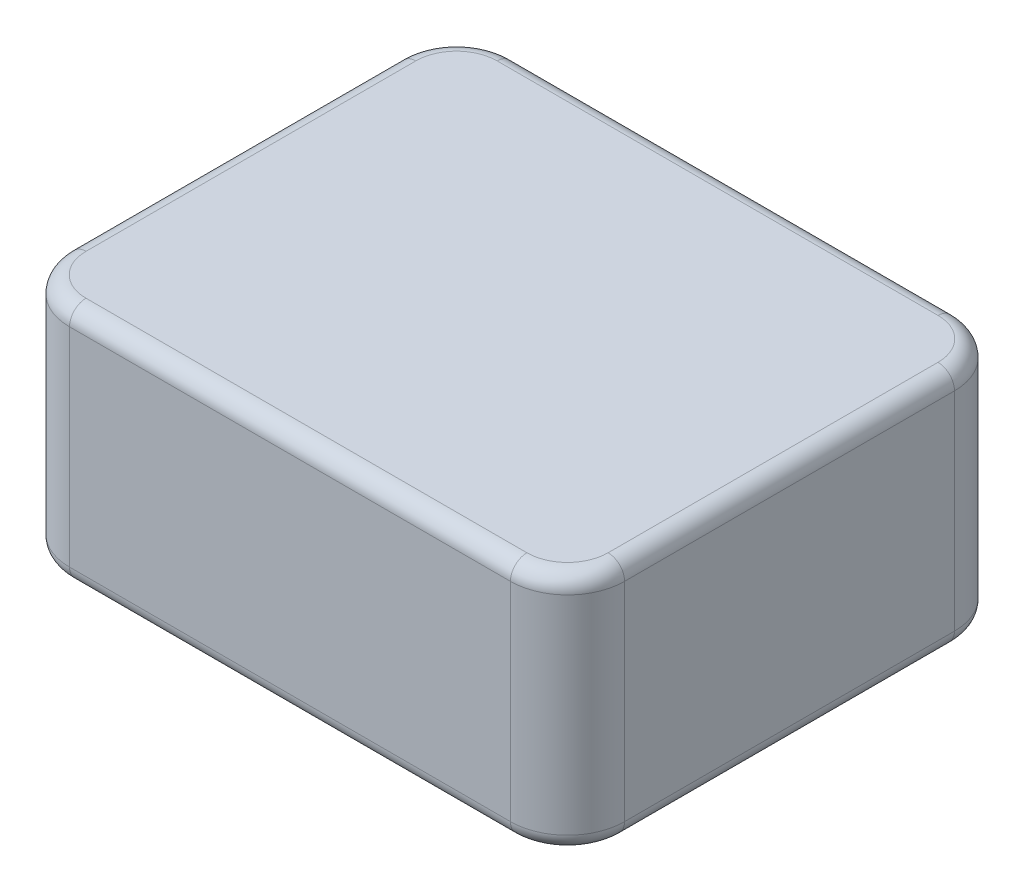
ISO-10303-21;
HEADER;
FILE_DESCRIPTION(('STEP AP214'),'2;1');
FILE_NAME('part.step','',(''),(''),'','','');
FILE_SCHEMA(('AUTOMOTIVE_DESIGN { 1 0 10303 214 1 1 1 1 }'));
ENDSEC;
DATA;
#1=APPLICATION_CONTEXT('core data for automotive mechanical design processes');
#2=APPLICATION_PROTOCOL_DEFINITION('international standard','automotive_design',2000,#1);
#3=PRODUCT_CONTEXT('',#1,'mechanical');
#4=PRODUCT('Part','Part','',(#3));
#5=PRODUCT_RELATED_PRODUCT_CATEGORY('part','',(#4));
#6=PRODUCT_DEFINITION_FORMATION('','',#4);
#7=PRODUCT_DEFINITION_CONTEXT('part definition',#1,'design');
#8=PRODUCT_DEFINITION('design','',#6,#7);
#9=PRODUCT_DEFINITION_SHAPE('','',#8);
#10=(LENGTH_UNIT() NAMED_UNIT(*) SI_UNIT(.MILLI.,.METRE.));
#11=(NAMED_UNIT(*) PLANE_ANGLE_UNIT() SI_UNIT($,.RADIAN.));
#12=(NAMED_UNIT(*) SI_UNIT($,.STERADIAN.) SOLID_ANGLE_UNIT());
#13=UNCERTAINTY_MEASURE_WITH_UNIT(LENGTH_MEASURE(1.E-05),#10,'distance_accuracy_value','');
#14=(GEOMETRIC_REPRESENTATION_CONTEXT(3) GLOBAL_UNCERTAINTY_ASSIGNED_CONTEXT((#13)) GLOBAL_UNIT_ASSIGNED_CONTEXT((#10,
#11,#12)) REPRESENTATION_CONTEXT('',''));
#15=CARTESIAN_POINT('',(0.,0.,0.));
#16=DIRECTION('',(0.,0.,1.));
#17=DIRECTION('',(1.,0.,0.));
#18=AXIS2_PLACEMENT_3D('',#15,#16,#17);
#19=CARTESIAN_POINT('',(11.43,48.26,-77.47));
#20=DIRECTION('',(0.,-1.,0.));
#21=DIRECTION('',(0.,0.,-1.));
#22=AXIS2_PLACEMENT_3D('',#19,#20,#21);
#23=CYLINDRICAL_SURFACE('',#22,11.43);
#24=DIRECTION('',(0.,-1.,0.));
#25=VECTOR('',#24,1.);
#26=CARTESIAN_POINT('',(11.4300000000001,48.26,-88.9));
#27=LINE('',#26,#25);
#28=CARTESIAN_POINT('',(11.4300000000001,44.958,-88.9));
#29=VERTEX_POINT('',#28);
#30=CARTESIAN_POINT('',(11.4300000000001,3.30200000000001,-88.9));
#31=VERTEX_POINT('',#30);
#32=EDGE_CURVE('E267',#29,#31,#27,.T.);
#33=ORIENTED_EDGE('',*,*,#32,.T.);
#34=CARTESIAN_POINT('',(11.43,3.30199999999999,-77.47));
#35=DIRECTION('',(0.,-1.,0.));
#36=DIRECTION('',(0.,0.,-1.));
#37=AXIS2_PLACEMENT_3D('',#34,#35,#36);
#38=CIRCLE('',#37,11.43);
#39=CARTESIAN_POINT('',(0.,3.30200000000001,-77.4699999999999));
#40=VERTEX_POINT('',#39);
#41=EDGE_CURVE('E232',#31,#40,#38,.F.);
#42=ORIENTED_EDGE('',*,*,#41,.T.);
#43=DIRECTION('',(0.,-1.,0.));
#44=VECTOR('',#43,1.);
#45=CARTESIAN_POINT('',(0.,48.26,-77.4699999999999));
#46=LINE('',#45,#44);
#47=CARTESIAN_POINT('',(0.,44.958,-77.4699999999999));
#48=VERTEX_POINT('',#47);
#49=EDGE_CURVE('E171',#48,#40,#46,.T.);
#50=ORIENTED_EDGE('',*,*,#49,.F.);
#51=CARTESIAN_POINT('',(11.43,44.958,-77.47));
#52=DIRECTION('',(0.,-1.,0.));
#53=DIRECTION('',(0.,0.,-1.));
#54=AXIS2_PLACEMENT_3D('',#51,#52,#53);
#55=CIRCLE('',#54,11.43);
#56=EDGE_CURVE('E230',#48,#29,#55,.T.);
#57=ORIENTED_EDGE('',*,*,#56,.T.);
#58=EDGE_LOOP('',(#33,#42,#50,#57));
#59=FACE_BOUND('',#58,.T.);
#60=ADVANCED_FACE('F35',(#59),#23,.T.);
#61=CARTESIAN_POINT('',(0.,48.26,-11.4300000000001));
#62=DIRECTION('',(1.,0.,0.));
#63=DIRECTION('',(0.,0.,-1.));
#64=AXIS2_PLACEMENT_3D('',#61,#62,#63);
#65=PLANE('',#64);
#66=ORIENTED_EDGE('',*,*,#49,.T.);
#67=DIRECTION('',(0.,0.,1.));
#68=VECTOR('',#67,1.);
#69=CARTESIAN_POINT('',(0.,3.302,-11.4300000000001));
#70=LINE('',#69,#68);
#71=CARTESIAN_POINT('',(0.,3.30200000000001,-11.4300000000001));
#72=VERTEX_POINT('',#71);
#73=EDGE_CURVE('E170',#40,#72,#70,.T.);
#74=ORIENTED_EDGE('',*,*,#73,.T.);
#75=DIRECTION('',(0.,-1.,0.));
#76=VECTOR('',#75,1.);
#77=CARTESIAN_POINT('',(0.,48.26,-11.4300000000001));
#78=LINE('',#77,#76);
#79=CARTESIAN_POINT('',(0.,44.958,-11.4300000000001));
#80=VERTEX_POINT('',#79);
#81=EDGE_CURVE('E152',#80,#72,#78,.T.);
#82=ORIENTED_EDGE('',*,*,#81,.F.);
#83=DIRECTION('',(0.,0.,1.));
#84=VECTOR('',#83,1.);
#85=CARTESIAN_POINT('',(0.,44.958,-11.4300000000001));
#86=LINE('',#85,#84);
#87=EDGE_CURVE('E167',#80,#48,#86,.F.);
#88=ORIENTED_EDGE('',*,*,#87,.T.);
#89=EDGE_LOOP('',(#66,#74,#82,#88));
#90=FACE_BOUND('',#89,.T.);
#91=ADVANCED_FACE('F165',(#90),#65,.F.);
#92=CARTESIAN_POINT('',(11.43,48.26,-11.43));
#93=DIRECTION('',(0.,-1.,0.));
#94=DIRECTION('',(0.,0.,-1.));
#95=AXIS2_PLACEMENT_3D('',#92,#93,#94);
#96=CYLINDRICAL_SURFACE('',#95,11.43);
#97=ORIENTED_EDGE('',*,*,#81,.T.);
#98=CARTESIAN_POINT('',(11.43,3.30199999999999,-11.43));
#99=DIRECTION('',(0.,-1.,0.));
#100=DIRECTION('',(0.,0.,-1.));
#101=AXIS2_PLACEMENT_3D('',#98,#99,#100);
#102=CIRCLE('',#101,11.43);
#103=CARTESIAN_POINT('',(11.4300000000001,3.30200000000001,0.));
#104=VERTEX_POINT('',#103);
#105=EDGE_CURVE('E159',#72,#104,#102,.F.);
#106=ORIENTED_EDGE('',*,*,#105,.T.);
#107=DIRECTION('',(0.,-1.,0.));
#108=VECTOR('',#107,1.);
#109=CARTESIAN_POINT('',(11.4300000000001,48.26,0.));
#110=LINE('',#109,#108);
#111=CARTESIAN_POINT('',(11.4300000000001,44.958,0.));
#112=VERTEX_POINT('',#111);
#113=EDGE_CURVE('E154',#112,#104,#110,.T.);
#114=ORIENTED_EDGE('',*,*,#113,.F.);
#115=CARTESIAN_POINT('',(11.43,44.958,-11.43));
#116=DIRECTION('',(0.,-1.,0.));
#117=DIRECTION('',(0.,0.,-1.));
#118=AXIS2_PLACEMENT_3D('',#115,#116,#117);
#119=CIRCLE('',#118,11.43);
#120=EDGE_CURVE('E149',#112,#80,#119,.T.);
#121=ORIENTED_EDGE('',*,*,#120,.T.);
#122=EDGE_LOOP('',(#97,#106,#114,#121));
#123=FACE_BOUND('',#122,.T.);
#124=ADVANCED_FACE('F151',(#123),#96,.T.);
#125=CARTESIAN_POINT('',(11.4300000000001,48.26,0.));
#126=DIRECTION('',(0.,0.,-1.));
#127=DIRECTION('',(-1.,0.,0.));
#128=AXIS2_PLACEMENT_3D('',#125,#126,#127);
#129=PLANE('',#128);
#130=ORIENTED_EDGE('',*,*,#113,.T.);
#131=DIRECTION('',(1.,0.,0.));
#132=VECTOR('',#131,1.);
#133=CARTESIAN_POINT('',(99.6949999999999,3.302,0.));
#134=LINE('',#133,#132);
#135=CARTESIAN_POINT('',(99.6949999999999,3.30200000000001,0.));
#136=VERTEX_POINT('',#135);
#137=EDGE_CURVE('E211',#104,#136,#134,.T.);
#138=ORIENTED_EDGE('',*,*,#137,.T.);
#139=DIRECTION('',(0.,-1.,0.));
#140=VECTOR('',#139,1.);
#141=CARTESIAN_POINT('',(99.6949999999999,48.26,0.));
#142=LINE('',#141,#140);
#143=CARTESIAN_POINT('',(99.6949999999999,44.958,0.));
#144=VERTEX_POINT('',#143);
#145=EDGE_CURVE('E292',#144,#136,#142,.T.);
#146=ORIENTED_EDGE('',*,*,#145,.F.);
#147=DIRECTION('',(1.,0.,0.));
#148=VECTOR('',#147,1.);
#149=CARTESIAN_POINT('',(11.4300000000001,44.958,0.));
#150=LINE('',#149,#148);
#151=EDGE_CURVE('E209',#144,#112,#150,.F.);
#152=ORIENTED_EDGE('',*,*,#151,.T.);
#153=EDGE_LOOP('',(#130,#138,#146,#152));
#154=FACE_BOUND('',#153,.T.);
#155=ADVANCED_FACE('F289',(#154),#129,.F.);
#156=CARTESIAN_POINT('',(99.695,48.26,-11.43));
#157=DIRECTION('',(0.,-1.,0.));
#158=DIRECTION('',(0.,0.,-1.));
#159=AXIS2_PLACEMENT_3D('',#156,#157,#158);
#160=CYLINDRICAL_SURFACE('',#159,11.43);
#161=ORIENTED_EDGE('',*,*,#145,.T.);
#162=CARTESIAN_POINT('',(99.695,3.30199999999999,-11.43));
#163=DIRECTION('',(0.,-1.,0.));
#164=DIRECTION('',(0.,0.,-1.));
#165=AXIS2_PLACEMENT_3D('',#162,#163,#164);
#166=CIRCLE('',#165,11.43);
#167=CARTESIAN_POINT('',(111.125,3.30200000000001,-11.4300000000001));
#168=VERTEX_POINT('',#167);
#169=EDGE_CURVE('E215',#136,#168,#166,.F.);
#170=ORIENTED_EDGE('',*,*,#169,.T.);
#171=DIRECTION('',(0.,-1.,0.));
#172=VECTOR('',#171,1.);
#173=CARTESIAN_POINT('',(111.125,48.26,-11.4300000000001));
#174=LINE('',#173,#172);
#175=CARTESIAN_POINT('',(111.125,44.958,-11.4300000000001));
#176=VERTEX_POINT('',#175);
#177=EDGE_CURVE('E295',#176,#168,#174,.T.);
#178=ORIENTED_EDGE('',*,*,#177,.F.);
#179=CARTESIAN_POINT('',(99.695,44.958,-11.43));
#180=DIRECTION('',(0.,-1.,0.));
#181=DIRECTION('',(0.,0.,-1.));
#182=AXIS2_PLACEMENT_3D('',#179,#180,#181);
#183=CIRCLE('',#182,11.43);
#184=EDGE_CURVE('E213',#176,#144,#183,.T.);
#185=ORIENTED_EDGE('',*,*,#184,.T.);
#186=EDGE_LOOP('',(#161,#170,#178,#185));
#187=FACE_BOUND('',#186,.T.);
#188=ADVANCED_FACE('F340',(#187),#160,.T.);
#189=CARTESIAN_POINT('',(111.125,48.26,-11.4300000000001));
#190=DIRECTION('',(-1.,0.,0.));
#191=DIRECTION('',(0.,0.,1.));
#192=AXIS2_PLACEMENT_3D('',#189,#190,#191);
#193=PLANE('',#192);
#194=ORIENTED_EDGE('',*,*,#177,.T.);
#195=DIRECTION('',(0.,0.,-1.));
#196=VECTOR('',#195,1.);
#197=CARTESIAN_POINT('',(111.125,3.302,-77.4699999999999));
#198=LINE('',#197,#196);
#199=CARTESIAN_POINT('',(111.125,3.30200000000001,-77.4699999999999));
#200=VERTEX_POINT('',#199);
#201=EDGE_CURVE('E219',#168,#200,#198,.T.);
#202=ORIENTED_EDGE('',*,*,#201,.T.);
#203=DIRECTION('',(0.,-1.,0.));
#204=VECTOR('',#203,1.);
#205=CARTESIAN_POINT('',(111.125,48.26,-77.4699999999999));
#206=LINE('',#205,#204);
#207=CARTESIAN_POINT('',(111.125,44.958,-77.4699999999999));
#208=VERTEX_POINT('',#207);
#209=EDGE_CURVE('E299',#208,#200,#206,.T.);
#210=ORIENTED_EDGE('',*,*,#209,.F.);
#211=DIRECTION('',(0.,0.,-1.));
#212=VECTOR('',#211,1.);
#213=CARTESIAN_POINT('',(111.125,44.958,-11.4300000000001));
#214=LINE('',#213,#212);
#215=EDGE_CURVE('E217',#208,#176,#214,.F.);
#216=ORIENTED_EDGE('',*,*,#215,.T.);
#217=EDGE_LOOP('',(#194,#202,#210,#216));
#218=FACE_BOUND('',#217,.T.);
#219=ADVANCED_FACE('F343',(#218),#193,.F.);
#220=CARTESIAN_POINT('',(99.695,48.26,-77.47));
#221=DIRECTION('',(0.,-1.,0.));
#222=DIRECTION('',(0.,0.,-1.));
#223=AXIS2_PLACEMENT_3D('',#220,#221,#222);
#224=CYLINDRICAL_SURFACE('',#223,11.43);
#225=ORIENTED_EDGE('',*,*,#209,.T.);
#226=CARTESIAN_POINT('',(99.695,3.30199999999999,-77.47));
#227=DIRECTION('',(0.,-1.,0.));
#228=DIRECTION('',(0.,0.,-1.));
#229=AXIS2_PLACEMENT_3D('',#226,#227,#228);
#230=CIRCLE('',#229,11.43);
#231=CARTESIAN_POINT('',(99.6949999999999,3.30200000000001,-88.9));
#232=VERTEX_POINT('',#231);
#233=EDGE_CURVE('E223',#200,#232,#230,.F.);
#234=ORIENTED_EDGE('',*,*,#233,.T.);
#235=DIRECTION('',(0.,-1.,0.));
#236=VECTOR('',#235,1.);
#237=CARTESIAN_POINT('',(99.6949999999999,48.26,-88.9));
#238=LINE('',#237,#236);
#239=CARTESIAN_POINT('',(99.6949999999999,44.958,-88.9));
#240=VERTEX_POINT('',#239);
#241=EDGE_CURVE('E304',#240,#232,#238,.T.);
#242=ORIENTED_EDGE('',*,*,#241,.F.);
#243=CARTESIAN_POINT('',(99.695,44.958,-77.47));
#244=DIRECTION('',(0.,-1.,0.));
#245=DIRECTION('',(0.,0.,-1.));
#246=AXIS2_PLACEMENT_3D('',#243,#244,#245);
#247=CIRCLE('',#246,11.43);
#248=EDGE_CURVE('E221',#240,#208,#247,.T.);
#249=ORIENTED_EDGE('',*,*,#248,.T.);
#250=EDGE_LOOP('',(#225,#234,#242,#249));
#251=FACE_BOUND('',#250,.T.);
#252=ADVANCED_FACE('F357',(#251),#224,.T.);
#253=CARTESIAN_POINT('',(11.4300000000001,48.26,-88.9));
#254=DIRECTION('',(0.,0.,1.));
#255=DIRECTION('',(1.,0.,0.));
#256=AXIS2_PLACEMENT_3D('',#253,#254,#255);
#257=PLANE('',#256);
#258=ORIENTED_EDGE('',*,*,#241,.T.);
#259=DIRECTION('',(-1.,0.,0.));
#260=VECTOR('',#259,1.);
#261=CARTESIAN_POINT('',(11.4300000000001,3.302,-88.9));
#262=LINE('',#261,#260);
#263=EDGE_CURVE('E228',#232,#31,#262,.T.);
#264=ORIENTED_EDGE('',*,*,#263,.T.);
#265=ORIENTED_EDGE('',*,*,#32,.F.);
#266=DIRECTION('',(-1.,0.,0.));
#267=VECTOR('',#266,1.);
#268=CARTESIAN_POINT('',(11.4300000000001,44.958,-88.9));
#269=LINE('',#268,#267);
#270=EDGE_CURVE('E225',#29,#240,#269,.F.);
#271=ORIENTED_EDGE('',*,*,#270,.T.);
#272=EDGE_LOOP('',(#258,#264,#265,#271));
#273=FACE_BOUND('',#272,.T.);
#274=ADVANCED_FACE('F358',(#273),#257,.F.);
#275=CARTESIAN_POINT('',(11.43,48.26,-77.47));
#276=DIRECTION('',(0.,-1.,0.));
#277=DIRECTION('',(0.,0.,-1.));
#278=AXIS2_PLACEMENT_3D('',#275,#276,#277);
#279=PLANE('',#278);
#280=CARTESIAN_POINT('',(99.695,48.26,-77.47));
#281=DIRECTION('',(0.,-1.,0.));
#282=DIRECTION('',(0.,0.,-1.));
#283=AXIS2_PLACEMENT_3D('',#280,#281,#282);
#284=CIRCLE('',#283,8.128);
#285=CARTESIAN_POINT('',(107.823,48.26,-77.4699999999999));
#286=VERTEX_POINT('',#285);
#287=CARTESIAN_POINT('',(99.6949999999999,48.26,-85.598));
#288=VERTEX_POINT('',#287);
#289=EDGE_CURVE('E44',#286,#288,#284,.F.);
#290=ORIENTED_EDGE('',*,*,#289,.T.);
#291=DIRECTION('',(-1.,0.,0.));
#292=VECTOR('',#291,1.);
#293=CARTESIAN_POINT('',(11.43,48.26,-85.598));
#294=LINE('',#293,#292);
#295=CARTESIAN_POINT('',(11.4300000000001,48.26,-85.598));
#296=VERTEX_POINT('',#295);
#297=EDGE_CURVE('E11',#288,#296,#294,.T.);
#298=ORIENTED_EDGE('',*,*,#297,.T.);
#299=CARTESIAN_POINT('',(11.43,48.26,-77.47));
#300=DIRECTION('',(0.,-1.,0.));
#301=DIRECTION('',(0.,0.,-1.));
#302=AXIS2_PLACEMENT_3D('',#299,#300,#301);
#303=CIRCLE('',#302,8.128);
#304=CARTESIAN_POINT('',(3.302,48.26,-77.4699999999999));
#305=VERTEX_POINT('',#304);
#306=EDGE_CURVE('E234',#296,#305,#303,.F.);
#307=ORIENTED_EDGE('',*,*,#306,.T.);
#308=DIRECTION('',(0.,0.,1.));
#309=VECTOR('',#308,1.);
#310=CARTESIAN_POINT('',(3.302,48.26,-77.47));
#311=LINE('',#310,#309);
#312=CARTESIAN_POINT('',(3.302,48.26,-11.4300000000001));
#313=VERTEX_POINT('',#312);
#314=EDGE_CURVE('E236',#305,#313,#311,.T.);
#315=ORIENTED_EDGE('',*,*,#314,.T.);
#316=CARTESIAN_POINT('',(11.43,48.26,-11.43));
#317=DIRECTION('',(0.,-1.,0.));
#318=DIRECTION('',(0.,0.,-1.));
#319=AXIS2_PLACEMENT_3D('',#316,#317,#318);
#320=CIRCLE('',#319,8.128);
#321=CARTESIAN_POINT('',(11.4300000000001,48.26,-3.302));
#322=VERTEX_POINT('',#321);
#323=EDGE_CURVE('E177',#313,#322,#320,.F.);
#324=ORIENTED_EDGE('',*,*,#323,.T.);
#325=DIRECTION('',(1.,0.,0.));
#326=VECTOR('',#325,1.);
#327=CARTESIAN_POINT('',(11.43,48.26,-3.302));
#328=LINE('',#327,#326);
#329=CARTESIAN_POINT('',(99.695,48.26,-3.302));
#330=VERTEX_POINT('',#329);
#331=EDGE_CURVE('E239',#322,#330,#328,.T.);
#332=ORIENTED_EDGE('',*,*,#331,.T.);
#333=CARTESIAN_POINT('',(99.695,48.26,-11.43));
#334=DIRECTION('',(0.,-1.,0.));
#335=DIRECTION('',(0.,0.,-1.));
#336=AXIS2_PLACEMENT_3D('',#333,#334,#335);
#337=CIRCLE('',#336,8.128);
#338=CARTESIAN_POINT('',(107.823,48.26,-11.4300000000001));
#339=VERTEX_POINT('',#338);
#340=EDGE_CURVE('E241',#330,#339,#337,.F.);
#341=ORIENTED_EDGE('',*,*,#340,.T.);
#342=DIRECTION('',(0.,0.,-1.));
#343=VECTOR('',#342,1.);
#344=CARTESIAN_POINT('',(107.823,48.26,-77.47));
#345=LINE('',#344,#343);
#346=EDGE_CURVE('E55',#339,#286,#345,.T.);
#347=ORIENTED_EDGE('',*,*,#346,.T.);
#348=EDGE_LOOP('',(#290,#298,#307,#315,#324,#332,#341,#347));
#349=FACE_BOUND('',#348,.T.);
#350=ADVANCED_FACE('F367',(#349),#279,.F.);
#351=CARTESIAN_POINT('',(11.43,0.,-77.47));
#352=DIRECTION('',(0.,-1.,0.));
#353=DIRECTION('',(0.,0.,-1.));
#354=AXIS2_PLACEMENT_3D('',#351,#352,#353);
#355=PLANE('',#354);
#356=CARTESIAN_POINT('',(11.43,0.,-11.43));
#357=DIRECTION('',(0.,-1.,0.));
#358=DIRECTION('',(0.,0.,-1.));
#359=AXIS2_PLACEMENT_3D('',#356,#357,#358);
#360=CIRCLE('',#359,8.128);
#361=CARTESIAN_POINT('',(11.4300000000001,0.,-3.302));
#362=VERTEX_POINT('',#361);
#363=CARTESIAN_POINT('',(3.302,0.,-11.4300000000001));
#364=VERTEX_POINT('',#363);
#365=EDGE_CURVE('E204',#362,#364,#360,.T.);
#366=ORIENTED_EDGE('',*,*,#365,.T.);
#367=DIRECTION('',(0.,0.,1.));
#368=VECTOR('',#367,1.);
#369=CARTESIAN_POINT('',(3.302,0.,-77.4699999999999));
#370=LINE('',#369,#368);
#371=CARTESIAN_POINT('',(3.302,0.,-77.4699999999999));
#372=VERTEX_POINT('',#371);
#373=EDGE_CURVE('E160',#364,#372,#370,.F.);
#374=ORIENTED_EDGE('',*,*,#373,.T.);
#375=CARTESIAN_POINT('',(11.43,0.,-77.47));
#376=DIRECTION('',(0.,-1.,0.));
#377=DIRECTION('',(0.,0.,-1.));
#378=AXIS2_PLACEMENT_3D('',#375,#376,#377);
#379=CIRCLE('',#378,8.128);
#380=CARTESIAN_POINT('',(11.4300000000001,0.,-85.598));
#381=VERTEX_POINT('',#380);
#382=EDGE_CURVE('E189',#372,#381,#379,.T.);
#383=ORIENTED_EDGE('',*,*,#382,.T.);
#384=DIRECTION('',(-1.,0.,0.));
#385=VECTOR('',#384,1.);
#386=CARTESIAN_POINT('',(99.6949999999999,0.,-85.598));
#387=LINE('',#386,#385);
#388=CARTESIAN_POINT('',(99.695,0.,-85.598));
#389=VERTEX_POINT('',#388);
#390=EDGE_CURVE('E194',#381,#389,#387,.F.);
#391=ORIENTED_EDGE('',*,*,#390,.T.);
#392=CARTESIAN_POINT('',(99.695,0.,-77.47));
#393=DIRECTION('',(0.,-1.,0.));
#394=DIRECTION('',(0.,0.,-1.));
#395=AXIS2_PLACEMENT_3D('',#392,#393,#394);
#396=CIRCLE('',#395,8.128);
#397=CARTESIAN_POINT('',(107.823,0.,-77.4699999999999));
#398=VERTEX_POINT('',#397);
#399=EDGE_CURVE('E196',#389,#398,#396,.T.);
#400=ORIENTED_EDGE('',*,*,#399,.T.);
#401=DIRECTION('',(0.,0.,-1.));
#402=VECTOR('',#401,1.);
#403=CARTESIAN_POINT('',(107.823,0.,-11.4300000000001));
#404=LINE('',#403,#402);
#405=CARTESIAN_POINT('',(107.823,0.,-11.4300000000001));
#406=VERTEX_POINT('',#405);
#407=EDGE_CURVE('E198',#398,#406,#404,.F.);
#408=ORIENTED_EDGE('',*,*,#407,.T.);
#409=CARTESIAN_POINT('',(99.695,0.,-11.43));
#410=DIRECTION('',(0.,-1.,0.));
#411=DIRECTION('',(0.,0.,-1.));
#412=AXIS2_PLACEMENT_3D('',#409,#410,#411);
#413=CIRCLE('',#412,8.128);
#414=CARTESIAN_POINT('',(99.6949999999999,0.,-3.302));
#415=VERTEX_POINT('',#414);
#416=EDGE_CURVE('E200',#406,#415,#413,.T.);
#417=ORIENTED_EDGE('',*,*,#416,.T.);
#418=DIRECTION('',(1.,0.,0.));
#419=VECTOR('',#418,1.);
#420=CARTESIAN_POINT('',(11.4300000000001,0.,-3.302));
#421=LINE('',#420,#419);
#422=EDGE_CURVE('E202',#415,#362,#421,.F.);
#423=ORIENTED_EDGE('',*,*,#422,.T.);
#424=EDGE_LOOP('',(#366,#374,#383,#391,#400,#408,#417,#423));
#425=FACE_BOUND('',#424,.T.);
#426=ADVANCED_FACE('F369',(#425),#355,.T.);
#427=CARTESIAN_POINT('',(107.823,3.302,-11.4300000000001));
#428=DIRECTION('',(0.,0.,1.));
#429=DIRECTION('',(1.,0.,0.));
#430=AXIS2_PLACEMENT_3D('',#427,#428,#429);
#431=CYLINDRICAL_SURFACE('',#430,3.302);
#432=CARTESIAN_POINT('',(107.823,3.302,-11.4300000000001));
#433=DIRECTION('',(0.,0.,1.));
#434=DIRECTION('',(1.,0.,0.));
#435=AXIS2_PLACEMENT_3D('',#432,#433,#434);
#436=CIRCLE('',#435,3.302);
#437=EDGE_CURVE('E261',#406,#168,#436,.T.);
#438=ORIENTED_EDGE('',*,*,#437,.F.);
#439=ORIENTED_EDGE('',*,*,#407,.F.);
#440=CARTESIAN_POINT('',(107.823,3.302,-77.4699999999999));
#441=DIRECTION('',(0.,0.,-1.));
#442=DIRECTION('',(-1.,0.,0.));
#443=AXIS2_PLACEMENT_3D('',#440,#441,#442);
#444=CIRCLE('',#443,3.302);
#445=EDGE_CURVE('E264',#200,#398,#444,.T.);
#446=ORIENTED_EDGE('',*,*,#445,.F.);
#447=ORIENTED_EDGE('',*,*,#201,.F.);
#448=EDGE_LOOP('',(#438,#439,#446,#447));
#449=FACE_BOUND('',#448,.T.);
#450=ADVANCED_FACE('F348',(#449),#431,.T.);
#451=CARTESIAN_POINT('',(99.695,3.302,-77.47));
#452=DIRECTION('',(0.,-1.,0.));
#453=DIRECTION('',(0.,0.,-1.));
#454=AXIS2_PLACEMENT_3D('',#451,#452,#453);
#455=TOROIDAL_SURFACE('',#454,8.128,3.302);
#456=ORIENTED_EDGE('',*,*,#445,.T.);
#457=ORIENTED_EDGE('',*,*,#399,.F.);
#458=CARTESIAN_POINT('',(99.695,3.302,-85.598));
#459=DIRECTION('',(-1.,0.,0.));
#460=DIRECTION('',(0.,0.,1.));
#461=AXIS2_PLACEMENT_3D('',#458,#459,#460);
#462=CIRCLE('',#461,3.302);
#463=EDGE_CURVE('E258',#232,#389,#462,.T.);
#464=ORIENTED_EDGE('',*,*,#463,.F.);
#465=ORIENTED_EDGE('',*,*,#233,.F.);
#466=EDGE_LOOP('',(#456,#457,#464,#465));
#467=FACE_BOUND('',#466,.T.);
#468=ADVANCED_FACE('F354',(#467),#455,.T.);
#469=CARTESIAN_POINT('',(99.695,3.302,-11.43));
#470=DIRECTION('',(0.,-1.,0.));
#471=DIRECTION('',(0.,0.,-1.));
#472=AXIS2_PLACEMENT_3D('',#469,#470,#471);
#473=TOROIDAL_SURFACE('',#472,8.128,3.302);
#474=ORIENTED_EDGE('',*,*,#437,.T.);
#475=ORIENTED_EDGE('',*,*,#169,.F.);
#476=CARTESIAN_POINT('',(99.6949999999999,3.302,-3.302));
#477=DIRECTION('',(-1.,0.,0.));
#478=DIRECTION('',(0.,0.,1.));
#479=AXIS2_PLACEMENT_3D('',#476,#477,#478);
#480=CIRCLE('',#479,3.302);
#481=EDGE_CURVE('E255',#415,#136,#480,.T.);
#482=ORIENTED_EDGE('',*,*,#481,.F.);
#483=ORIENTED_EDGE('',*,*,#416,.F.);
#484=EDGE_LOOP('',(#474,#475,#482,#483));
#485=FACE_BOUND('',#484,.T.);
#486=ADVANCED_FACE('F337',(#485),#473,.T.);
#487=CARTESIAN_POINT('',(11.4300000000001,3.302,-85.598));
#488=DIRECTION('',(1.,0.,0.));
#489=DIRECTION('',(0.,0.,-1.));
#490=AXIS2_PLACEMENT_3D('',#487,#488,#489);
#491=CYLINDRICAL_SURFACE('',#490,3.302);
#492=ORIENTED_EDGE('',*,*,#463,.T.);
#493=ORIENTED_EDGE('',*,*,#390,.F.);
#494=CARTESIAN_POINT('',(11.4300000000001,3.302,-85.598));
#495=DIRECTION('',(-1.,0.,0.));
#496=DIRECTION('',(0.,0.,1.));
#497=AXIS2_PLACEMENT_3D('',#494,#495,#496);
#498=CIRCLE('',#497,3.302);
#499=EDGE_CURVE('E252',#31,#381,#498,.T.);
#500=ORIENTED_EDGE('',*,*,#499,.F.);
#501=ORIENTED_EDGE('',*,*,#263,.F.);
#502=EDGE_LOOP('',(#492,#493,#500,#501));
#503=FACE_BOUND('',#502,.T.);
#504=ADVANCED_FACE('F317',(#503),#491,.T.);
#505=CARTESIAN_POINT('',(11.4300000000001,3.302,-3.302));
#506=DIRECTION('',(-1.,0.,0.));
#507=DIRECTION('',(0.,0.,1.));
#508=AXIS2_PLACEMENT_3D('',#505,#506,#507);
#509=CYLINDRICAL_SURFACE('',#508,3.302);
#510=ORIENTED_EDGE('',*,*,#481,.T.);
#511=ORIENTED_EDGE('',*,*,#137,.F.);
#512=CARTESIAN_POINT('',(11.4300000000001,3.302,-3.302));
#513=DIRECTION('',(-1.,0.,0.));
#514=DIRECTION('',(0.,0.,1.));
#515=AXIS2_PLACEMENT_3D('',#512,#513,#514);
#516=CIRCLE('',#515,3.302);
#517=EDGE_CURVE('E249',#362,#104,#516,.T.);
#518=ORIENTED_EDGE('',*,*,#517,.F.);
#519=ORIENTED_EDGE('',*,*,#422,.F.);
#520=EDGE_LOOP('',(#510,#511,#518,#519));
#521=FACE_BOUND('',#520,.T.);
#522=ADVANCED_FACE('F333',(#521),#509,.T.);
#523=CARTESIAN_POINT('',(11.43,3.302,-77.47));
#524=DIRECTION('',(0.,-1.,0.));
#525=DIRECTION('',(0.,0.,-1.));
#526=AXIS2_PLACEMENT_3D('',#523,#524,#525);
#527=TOROIDAL_SURFACE('',#526,8.128,3.302);
#528=ORIENTED_EDGE('',*,*,#499,.T.);
#529=ORIENTED_EDGE('',*,*,#382,.F.);
#530=CARTESIAN_POINT('',(3.302,3.302,-77.4699999999999));
#531=DIRECTION('',(0.,0.,1.));
#532=DIRECTION('',(0.,-1.,0.));
#533=AXIS2_PLACEMENT_3D('',#530,#531,#532);
#534=CIRCLE('',#533,3.302);
#535=EDGE_CURVE('E247',#40,#372,#534,.T.);
#536=ORIENTED_EDGE('',*,*,#535,.F.);
#537=ORIENTED_EDGE('',*,*,#41,.F.);
#538=EDGE_LOOP('',(#528,#529,#536,#537));
#539=FACE_BOUND('',#538,.T.);
#540=ADVANCED_FACE('F321',(#539),#527,.T.);
#541=CARTESIAN_POINT('',(11.43,3.302,-11.43));
#542=DIRECTION('',(0.,-1.,0.));
#543=DIRECTION('',(0.,0.,-1.));
#544=AXIS2_PLACEMENT_3D('',#541,#542,#543);
#545=TOROIDAL_SURFACE('',#544,8.128,3.302);
#546=ORIENTED_EDGE('',*,*,#517,.T.);
#547=ORIENTED_EDGE('',*,*,#105,.F.);
#548=CARTESIAN_POINT('',(3.302,3.302,-11.4300000000001));
#549=DIRECTION('',(0.,0.,-1.));
#550=DIRECTION('',(-1.,0.,0.));
#551=AXIS2_PLACEMENT_3D('',#548,#549,#550);
#552=CIRCLE('',#551,3.302);
#553=EDGE_CURVE('E245',#364,#72,#552,.T.);
#554=ORIENTED_EDGE('',*,*,#553,.F.);
#555=ORIENTED_EDGE('',*,*,#365,.F.);
#556=EDGE_LOOP('',(#546,#547,#554,#555));
#557=FACE_BOUND('',#556,.T.);
#558=ADVANCED_FACE('F329',(#557),#545,.T.);
#559=CARTESIAN_POINT('',(3.302,3.302,-11.4300000000001));
#560=DIRECTION('',(0.,0.,-1.));
#561=DIRECTION('',(-1.,0.,0.));
#562=AXIS2_PLACEMENT_3D('',#559,#560,#561);
#563=CYLINDRICAL_SURFACE('',#562,3.302);
#564=ORIENTED_EDGE('',*,*,#535,.T.);
#565=ORIENTED_EDGE('',*,*,#373,.F.);
#566=ORIENTED_EDGE('',*,*,#553,.T.);
#567=ORIENTED_EDGE('',*,*,#73,.F.);
#568=EDGE_LOOP('',(#564,#565,#566,#567));
#569=FACE_BOUND('',#568,.T.);
#570=ADVANCED_FACE('F324',(#569),#563,.T.);
#571=CARTESIAN_POINT('',(11.43,44.958,-3.302));
#572=DIRECTION('',(1.,0.,0.));
#573=DIRECTION('',(0.,0.,-1.));
#574=AXIS2_PLACEMENT_3D('',#571,#572,#573);
#575=CYLINDRICAL_SURFACE('',#574,3.302);
#576=CARTESIAN_POINT('',(11.4300000000001,44.958,-3.302));
#577=DIRECTION('',(-1.,0.,0.));
#578=DIRECTION('',(0.,0.,1.));
#579=AXIS2_PLACEMENT_3D('',#576,#577,#578);
#580=CIRCLE('',#579,3.302);
#581=EDGE_CURVE('E276',#112,#322,#580,.T.);
#582=ORIENTED_EDGE('',*,*,#581,.F.);
#583=ORIENTED_EDGE('',*,*,#151,.F.);
#584=CARTESIAN_POINT('',(99.695,44.958,-3.302));
#585=DIRECTION('',(1.,0.,0.));
#586=DIRECTION('',(0.,0.,-1.));
#587=AXIS2_PLACEMENT_3D('',#584,#585,#586);
#588=CIRCLE('',#587,3.302);
#589=EDGE_CURVE('E39',#330,#144,#588,.T.);
#590=ORIENTED_EDGE('',*,*,#589,.F.);
#591=ORIENTED_EDGE('',*,*,#331,.F.);
#592=EDGE_LOOP('',(#582,#583,#590,#591));
#593=FACE_BOUND('',#592,.T.);
#594=ADVANCED_FACE('F37',(#593),#575,.T.);
#595=CARTESIAN_POINT('',(99.695,44.958,-11.43));
#596=DIRECTION('',(0.,-1.,0.));
#597=DIRECTION('',(0.,0.,-1.));
#598=AXIS2_PLACEMENT_3D('',#595,#596,#597);
#599=TOROIDAL_SURFACE('',#598,8.128,3.302);
#600=ORIENTED_EDGE('',*,*,#589,.T.);
#601=ORIENTED_EDGE('',*,*,#184,.F.);
#602=CARTESIAN_POINT('',(107.823,44.958,-11.4300000000001));
#603=DIRECTION('',(0.,0.,-1.));
#604=DIRECTION('',(-1.,0.,0.));
#605=AXIS2_PLACEMENT_3D('',#602,#603,#604);
#606=CIRCLE('',#605,3.302);
#607=EDGE_CURVE('E180',#339,#176,#606,.T.);
#608=ORIENTED_EDGE('',*,*,#607,.F.);
#609=ORIENTED_EDGE('',*,*,#340,.F.);
#610=EDGE_LOOP('',(#600,#601,#608,#609));
#611=FACE_BOUND('',#610,.T.);
#612=ADVANCED_FACE('F282',(#611),#599,.T.);
#613=CARTESIAN_POINT('',(11.43,44.958,-11.43));
#614=DIRECTION('',(0.,-1.,0.));
#615=DIRECTION('',(0.,0.,-1.));
#616=AXIS2_PLACEMENT_3D('',#613,#614,#615);
#617=TOROIDAL_SURFACE('',#616,8.128,3.302);
#618=ORIENTED_EDGE('',*,*,#581,.T.);
#619=ORIENTED_EDGE('',*,*,#323,.F.);
#620=CARTESIAN_POINT('',(3.302,44.958,-11.4300000000001));
#621=DIRECTION('',(0.,0.,-1.));
#622=DIRECTION('',(-1.,0.,0.));
#623=AXIS2_PLACEMENT_3D('',#620,#621,#622);
#624=CIRCLE('',#623,3.302);
#625=EDGE_CURVE('E175',#80,#313,#624,.T.);
#626=ORIENTED_EDGE('',*,*,#625,.F.);
#627=ORIENTED_EDGE('',*,*,#120,.F.);
#628=EDGE_LOOP('',(#618,#619,#626,#627));
#629=FACE_BOUND('',#628,.T.);
#630=ADVANCED_FACE('F176',(#629),#617,.T.);
#631=CARTESIAN_POINT('',(107.823,44.958,-77.47));
#632=DIRECTION('',(0.,0.,-1.));
#633=DIRECTION('',(-1.,0.,0.));
#634=AXIS2_PLACEMENT_3D('',#631,#632,#633);
#635=CYLINDRICAL_SURFACE('',#634,3.302);
#636=ORIENTED_EDGE('',*,*,#607,.T.);
#637=ORIENTED_EDGE('',*,*,#215,.F.);
#638=CARTESIAN_POINT('',(107.823,44.958,-77.4699999999999));
#639=DIRECTION('',(0.,0.,-1.));
#640=DIRECTION('',(-1.,0.,0.));
#641=AXIS2_PLACEMENT_3D('',#638,#639,#640);
#642=CIRCLE('',#641,3.302);
#643=EDGE_CURVE('E181',#286,#208,#642,.T.);
#644=ORIENTED_EDGE('',*,*,#643,.F.);
#645=ORIENTED_EDGE('',*,*,#346,.F.);
#646=EDGE_LOOP('',(#636,#637,#644,#645));
#647=FACE_BOUND('',#646,.T.);
#648=ADVANCED_FACE('F412',(#647),#635,.T.);
#649=CARTESIAN_POINT('',(3.302,44.958,-77.47));
#650=DIRECTION('',(0.,0.,1.));
#651=DIRECTION('',(1.,0.,0.));
#652=AXIS2_PLACEMENT_3D('',#649,#650,#651);
#653=CYLINDRICAL_SURFACE('',#652,3.302);
#654=ORIENTED_EDGE('',*,*,#625,.T.);
#655=ORIENTED_EDGE('',*,*,#314,.F.);
#656=CARTESIAN_POINT('',(3.302,44.958,-77.4699999999999));
#657=DIRECTION('',(0.,0.,-1.));
#658=DIRECTION('',(-1.,0.,0.));
#659=AXIS2_PLACEMENT_3D('',#656,#657,#658);
#660=CIRCLE('',#659,3.302);
#661=EDGE_CURVE('E186',#48,#305,#660,.T.);
#662=ORIENTED_EDGE('',*,*,#661,.F.);
#663=ORIENTED_EDGE('',*,*,#87,.F.);
#664=EDGE_LOOP('',(#654,#655,#662,#663));
#665=FACE_BOUND('',#664,.T.);
#666=ADVANCED_FACE('F184',(#665),#653,.T.);
#667=CARTESIAN_POINT('',(99.695,44.958,-77.47));
#668=DIRECTION('',(0.,-1.,0.));
#669=DIRECTION('',(0.,0.,-1.));
#670=AXIS2_PLACEMENT_3D('',#667,#668,#669);
#671=TOROIDAL_SURFACE('',#670,8.128,3.302);
#672=ORIENTED_EDGE('',*,*,#643,.T.);
#673=ORIENTED_EDGE('',*,*,#248,.F.);
#674=CARTESIAN_POINT('',(99.6949999999999,44.958,-85.598));
#675=DIRECTION('',(-1.,0.,0.));
#676=DIRECTION('',(0.,0.,1.));
#677=AXIS2_PLACEMENT_3D('',#674,#675,#676);
#678=CIRCLE('',#677,3.302);
#679=EDGE_CURVE('E270',#288,#240,#678,.T.);
#680=ORIENTED_EDGE('',*,*,#679,.F.);
#681=ORIENTED_EDGE('',*,*,#289,.F.);
#682=EDGE_LOOP('',(#672,#673,#680,#681));
#683=FACE_BOUND('',#682,.T.);
#684=ADVANCED_FACE('F406',(#683),#671,.T.);
#685=CARTESIAN_POINT('',(11.43,44.958,-77.47));
#686=DIRECTION('',(0.,-1.,0.));
#687=DIRECTION('',(0.,0.,-1.));
#688=AXIS2_PLACEMENT_3D('',#685,#686,#687);
#689=TOROIDAL_SURFACE('',#688,8.128,3.302);
#690=ORIENTED_EDGE('',*,*,#661,.T.);
#691=ORIENTED_EDGE('',*,*,#306,.F.);
#692=CARTESIAN_POINT('',(11.4300000000001,44.958,-85.598));
#693=DIRECTION('',(1.,0.,0.));
#694=DIRECTION('',(0.,0.,-1.));
#695=AXIS2_PLACEMENT_3D('',#692,#693,#694);
#696=CIRCLE('',#695,3.302);
#697=EDGE_CURVE('E268',#29,#296,#696,.T.);
#698=ORIENTED_EDGE('',*,*,#697,.F.);
#699=ORIENTED_EDGE('',*,*,#56,.F.);
#700=EDGE_LOOP('',(#690,#691,#698,#699));
#701=FACE_BOUND('',#700,.T.);
#702=ADVANCED_FACE('F366',(#701),#689,.T.);
#703=CARTESIAN_POINT('',(11.43,44.958,-85.598));
#704=DIRECTION('',(-1.,0.,0.));
#705=DIRECTION('',(0.,0.,1.));
#706=AXIS2_PLACEMENT_3D('',#703,#704,#705);
#707=CYLINDRICAL_SURFACE('',#706,3.302);
#708=ORIENTED_EDGE('',*,*,#679,.T.);
#709=ORIENTED_EDGE('',*,*,#270,.F.);
#710=ORIENTED_EDGE('',*,*,#697,.T.);
#711=ORIENTED_EDGE('',*,*,#297,.F.);
#712=EDGE_LOOP('',(#708,#709,#710,#711));
#713=FACE_BOUND('',#712,.T.);
#714=ADVANCED_FACE('F361',(#713),#707,.T.);
#715=CLOSED_SHELL('',(#60,#91,#124,#155,#188,#219,#252,#274,#350,#426,#450,#468,#486,#504,#522,
#540,#558,#570,#594,#612,#630,#648,#666,#684,#702,#714));
#716=MANIFOLD_SOLID_BREP('B2',#715);
#717=ADVANCED_BREP_SHAPE_REPRESENTATION('',(#18,#716),#14);
#718=SHAPE_DEFINITION_REPRESENTATION(#9,#717);
ENDSEC;
END-ISO-10303-21;
